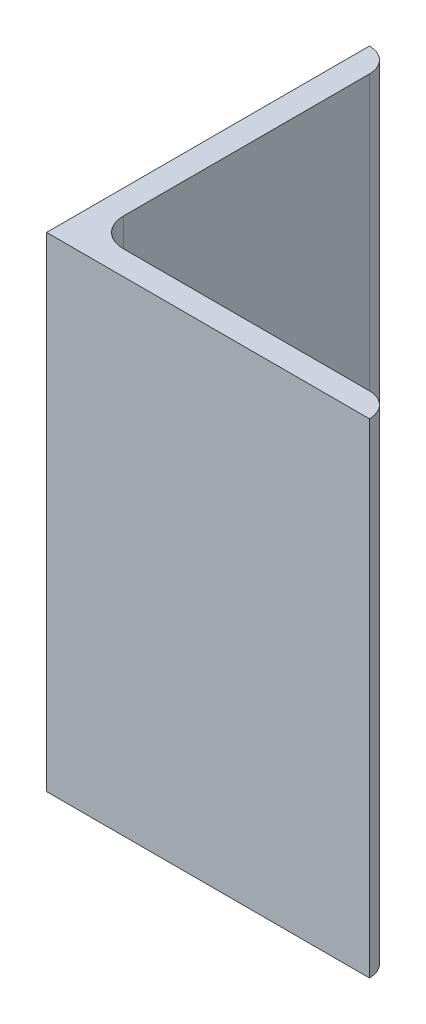
ISO-10303-21;
HEADER;
FILE_DESCRIPTION(('STEP AP214'),'2;1');
FILE_NAME('part.step','',(''),(''),'','','');
FILE_SCHEMA(('AUTOMOTIVE_DESIGN { 1 0 10303 214 1 1 1 1 }'));
ENDSEC;
DATA;
#1=APPLICATION_CONTEXT('core data for automotive mechanical design processes');
#2=APPLICATION_PROTOCOL_DEFINITION('international standard','automotive_design',2000,#1);
#3=PRODUCT_CONTEXT('',#1,'mechanical');
#4=PRODUCT('Part','Part','',(#3));
#5=PRODUCT_RELATED_PRODUCT_CATEGORY('part','',(#4));
#6=PRODUCT_DEFINITION_FORMATION('','',#4);
#7=PRODUCT_DEFINITION_CONTEXT('part definition',#1,'design');
#8=PRODUCT_DEFINITION('design','',#6,#7);
#9=PRODUCT_DEFINITION_SHAPE('','',#8);
#10=(LENGTH_UNIT() NAMED_UNIT(*) SI_UNIT(.MILLI.,.METRE.));
#11=(NAMED_UNIT(*) PLANE_ANGLE_UNIT() SI_UNIT($,.RADIAN.));
#12=(NAMED_UNIT(*) SI_UNIT($,.STERADIAN.) SOLID_ANGLE_UNIT());
#13=UNCERTAINTY_MEASURE_WITH_UNIT(LENGTH_MEASURE(1.E-05),#10,'distance_accuracy_value','');
#14=(GEOMETRIC_REPRESENTATION_CONTEXT(3) GLOBAL_UNCERTAINTY_ASSIGNED_CONTEXT((#13)) GLOBAL_UNIT_ASSIGNED_CONTEXT((#10,
#11,#12)) REPRESENTATION_CONTEXT('',''));
#15=CARTESIAN_POINT('',(0.,0.,0.));
#16=DIRECTION('',(0.,0.,1.));
#17=DIRECTION('',(1.,0.,0.));
#18=AXIS2_PLACEMENT_3D('',#15,#16,#17);
#19=CARTESIAN_POINT('',(40.,60.,0.));
#20=DIRECTION('',(0.,0.,-1.));
#21=DIRECTION('',(-1.,0.,0.));
#22=AXIS2_PLACEMENT_3D('',#19,#20,#21);
#23=PLANE('',#22);
#24=DIRECTION('',(1.,0.,0.));
#25=VECTOR('',#24,1.);
#26=CARTESIAN_POINT('',(40.,0.,0.));
#27=LINE('',#26,#25);
#28=CARTESIAN_POINT('',(0.,0.,0.));
#29=VERTEX_POINT('',#28);
#30=CARTESIAN_POINT('',(40.,0.,0.));
#31=VERTEX_POINT('',#30);
#32=EDGE_CURVE('E160',#29,#31,#27,.T.);
#33=ORIENTED_EDGE('',*,*,#32,.T.);
#34=DIRECTION('',(0.,-1.,0.));
#35=VECTOR('',#34,1.);
#36=CARTESIAN_POINT('',(40.,60.,0.));
#37=LINE('',#36,#35);
#38=CARTESIAN_POINT('',(40.,60.,0.));
#39=VERTEX_POINT('',#38);
#40=EDGE_CURVE('E13',#39,#31,#37,.T.);
#41=ORIENTED_EDGE('',*,*,#40,.F.);
#42=DIRECTION('',(1.,0.,0.));
#43=VECTOR('',#42,1.);
#44=CARTESIAN_POINT('',(40.,60.,0.));
#45=LINE('',#44,#43);
#46=CARTESIAN_POINT('',(0.,60.,0.));
#47=VERTEX_POINT('',#46);
#48=EDGE_CURVE('E179',#47,#39,#45,.T.);
#49=ORIENTED_EDGE('',*,*,#48,.F.);
#50=DIRECTION('',(0.,-1.,0.));
#51=VECTOR('',#50,1.);
#52=CARTESIAN_POINT('',(0.,60.,0.));
#53=LINE('',#52,#51);
#54=EDGE_CURVE('E156',#47,#29,#53,.T.);
#55=ORIENTED_EDGE('',*,*,#54,.T.);
#56=EDGE_LOOP('',(#33,#41,#49,#55));
#57=FACE_BOUND('',#56,.T.);
#58=ADVANCED_FACE('F65',(#57),#23,.F.);
#59=CARTESIAN_POINT('',(37.,60.,0.));
#60=DIRECTION('',(0.,-1.,0.));
#61=DIRECTION('',(0.,0.,-1.));
#62=AXIS2_PLACEMENT_3D('',#59,#60,#61);
#63=CYLINDRICAL_SURFACE('',#62,3.00000000000001);
#64=CARTESIAN_POINT('',(37.,0.,0.));
#65=DIRECTION('',(0.,1.,0.));
#66=DIRECTION('',(0.,0.,1.));
#67=AXIS2_PLACEMENT_3D('',#64,#65,#66);
#68=CIRCLE('',#67,3.00000000000001);
#69=CARTESIAN_POINT('',(37.,0.,-3.));
#70=VERTEX_POINT('',#69);
#71=EDGE_CURVE('E164',#31,#70,#68,.T.);
#72=ORIENTED_EDGE('',*,*,#71,.T.);
#73=DIRECTION('',(0.,-1.,0.));
#74=VECTOR('',#73,1.);
#75=CARTESIAN_POINT('',(37.,60.,-3.));
#76=LINE('',#75,#74);
#77=CARTESIAN_POINT('',(37.,60.,-3.));
#78=VERTEX_POINT('',#77);
#79=EDGE_CURVE('E74',#78,#70,#76,.T.);
#80=ORIENTED_EDGE('',*,*,#79,.F.);
#81=CARTESIAN_POINT('',(37.,60.,0.));
#82=DIRECTION('',(0.,1.,0.));
#83=DIRECTION('',(0.,0.,1.));
#84=AXIS2_PLACEMENT_3D('',#81,#82,#83);
#85=CIRCLE('',#84,3.00000000000001);
#86=EDGE_CURVE('E122',#39,#78,#85,.T.);
#87=ORIENTED_EDGE('',*,*,#86,.F.);
#88=ORIENTED_EDGE('',*,*,#40,.T.);
#89=EDGE_LOOP('',(#72,#80,#87,#88));
#90=FACE_BOUND('',#89,.T.);
#91=ADVANCED_FACE('F213',(#90),#63,.T.);
#92=CARTESIAN_POINT('',(6.5,60.,-3.));
#93=DIRECTION('',(0.,0.,1.));
#94=DIRECTION('',(1.,0.,0.));
#95=AXIS2_PLACEMENT_3D('',#92,#93,#94);
#96=PLANE('',#95);
#97=DIRECTION('',(-1.,0.,0.));
#98=VECTOR('',#97,1.);
#99=CARTESIAN_POINT('',(6.5,0.,-3.));
#100=LINE('',#99,#98);
#101=CARTESIAN_POINT('',(6.5,0.,-3.));
#102=VERTEX_POINT('',#101);
#103=EDGE_CURVE('E167',#70,#102,#100,.T.);
#104=ORIENTED_EDGE('',*,*,#103,.T.);
#105=DIRECTION('',(0.,-1.,0.));
#106=VECTOR('',#105,1.);
#107=CARTESIAN_POINT('',(6.5,60.,-3.));
#108=LINE('',#107,#106);
#109=CARTESIAN_POINT('',(6.5,60.,-3.));
#110=VERTEX_POINT('',#109);
#111=EDGE_CURVE('E186',#110,#102,#108,.T.);
#112=ORIENTED_EDGE('',*,*,#111,.F.);
#113=DIRECTION('',(-1.,0.,0.));
#114=VECTOR('',#113,1.);
#115=CARTESIAN_POINT('',(6.5,60.,-3.));
#116=LINE('',#115,#114);
#117=EDGE_CURVE('E196',#78,#110,#116,.T.);
#118=ORIENTED_EDGE('',*,*,#117,.F.);
#119=ORIENTED_EDGE('',*,*,#79,.T.);
#120=EDGE_LOOP('',(#104,#112,#118,#119));
#121=FACE_BOUND('',#120,.T.);
#122=ADVANCED_FACE('F194',(#121),#96,.F.);
#123=CARTESIAN_POINT('',(6.5,60.,-6.5));
#124=DIRECTION('',(0.,-1.,0.));
#125=DIRECTION('',(0.,0.,-1.));
#126=AXIS2_PLACEMENT_3D('',#123,#124,#125);
#127=CYLINDRICAL_SURFACE('',#126,3.5);
#128=CARTESIAN_POINT('',(6.5,0.,-6.5));
#129=DIRECTION('',(0.,-1.,0.));
#130=DIRECTION('',(0.,0.,-1.));
#131=AXIS2_PLACEMENT_3D('',#128,#129,#130);
#132=CIRCLE('',#131,3.5);
#133=CARTESIAN_POINT('',(3.,0.,-6.5));
#134=VERTEX_POINT('',#133);
#135=EDGE_CURVE('E170',#102,#134,#132,.T.);
#136=ORIENTED_EDGE('',*,*,#135,.T.);
#137=DIRECTION('',(0.,-1.,0.));
#138=VECTOR('',#137,1.);
#139=CARTESIAN_POINT('',(3.,60.,-6.5));
#140=LINE('',#139,#138);
#141=CARTESIAN_POINT('',(3.,60.,-6.5));
#142=VERTEX_POINT('',#141);
#143=EDGE_CURVE('E149',#142,#134,#140,.T.);
#144=ORIENTED_EDGE('',*,*,#143,.F.);
#145=CARTESIAN_POINT('',(6.5,60.,-6.5));
#146=DIRECTION('',(0.,-1.,0.));
#147=DIRECTION('',(0.,0.,-1.));
#148=AXIS2_PLACEMENT_3D('',#145,#146,#147);
#149=CIRCLE('',#148,3.5);
#150=EDGE_CURVE('E138',#110,#142,#149,.T.);
#151=ORIENTED_EDGE('',*,*,#150,.F.);
#152=ORIENTED_EDGE('',*,*,#111,.T.);
#153=EDGE_LOOP('',(#136,#144,#151,#152));
#154=FACE_BOUND('',#153,.T.);
#155=ADVANCED_FACE('F202',(#154),#127,.F.);
#156=CARTESIAN_POINT('',(3.,60.,-37.));
#157=DIRECTION('',(-1.,0.,0.));
#158=DIRECTION('',(0.,0.,1.));
#159=AXIS2_PLACEMENT_3D('',#156,#157,#158);
#160=PLANE('',#159);
#161=DIRECTION('',(0.,0.,-1.));
#162=VECTOR('',#161,1.);
#163=CARTESIAN_POINT('',(3.,0.,-37.));
#164=LINE('',#163,#162);
#165=CARTESIAN_POINT('',(3.,0.,-37.));
#166=VERTEX_POINT('',#165);
#167=EDGE_CURVE('E147',#134,#166,#164,.T.);
#168=ORIENTED_EDGE('',*,*,#167,.T.);
#169=DIRECTION('',(0.,-1.,0.));
#170=VECTOR('',#169,1.);
#171=CARTESIAN_POINT('',(3.,60.,-37.));
#172=LINE('',#171,#170);
#173=CARTESIAN_POINT('',(3.,60.,-37.));
#174=VERTEX_POINT('',#173);
#175=EDGE_CURVE('E144',#174,#166,#172,.T.);
#176=ORIENTED_EDGE('',*,*,#175,.F.);
#177=DIRECTION('',(0.,0.,-1.));
#178=VECTOR('',#177,1.);
#179=CARTESIAN_POINT('',(3.,60.,-37.));
#180=LINE('',#179,#178);
#181=EDGE_CURVE('E132',#142,#174,#180,.T.);
#182=ORIENTED_EDGE('',*,*,#181,.F.);
#183=ORIENTED_EDGE('',*,*,#143,.T.);
#184=EDGE_LOOP('',(#168,#176,#182,#183));
#185=FACE_BOUND('',#184,.T.);
#186=ADVANCED_FACE('F145',(#185),#160,.F.);
#187=CARTESIAN_POINT('',(0.,60.,-37.));
#188=DIRECTION('',(0.,-1.,0.));
#189=DIRECTION('',(0.,0.,-1.));
#190=AXIS2_PLACEMENT_3D('',#187,#188,#189);
#191=CYLINDRICAL_SURFACE('',#190,3.);
#192=CARTESIAN_POINT('',(0.,0.,-37.));
#193=DIRECTION('',(0.,1.,0.));
#194=DIRECTION('',(0.,0.,-1.));
#195=AXIS2_PLACEMENT_3D('',#192,#193,#194);
#196=CIRCLE('',#195,3.);
#197=CARTESIAN_POINT('',(0.,0.,-40.));
#198=VERTEX_POINT('',#197);
#199=EDGE_CURVE('E108',#166,#198,#196,.T.);
#200=ORIENTED_EDGE('',*,*,#199,.T.);
#201=DIRECTION('',(0.,-1.,0.));
#202=VECTOR('',#201,1.);
#203=CARTESIAN_POINT('',(0.,60.,-40.));
#204=LINE('',#203,#202);
#205=CARTESIAN_POINT('',(0.,60.,-40.));
#206=VERTEX_POINT('',#205);
#207=EDGE_CURVE('E150',#206,#198,#204,.T.);
#208=ORIENTED_EDGE('',*,*,#207,.F.);
#209=CARTESIAN_POINT('',(0.,60.,-37.));
#210=DIRECTION('',(0.,1.,0.));
#211=DIRECTION('',(0.,0.,-1.));
#212=AXIS2_PLACEMENT_3D('',#209,#210,#211);
#213=CIRCLE('',#212,3.);
#214=EDGE_CURVE('E136',#174,#206,#213,.T.);
#215=ORIENTED_EDGE('',*,*,#214,.F.);
#216=ORIENTED_EDGE('',*,*,#175,.T.);
#217=EDGE_LOOP('',(#200,#208,#215,#216));
#218=FACE_BOUND('',#217,.T.);
#219=ADVANCED_FACE('F152',(#218),#191,.T.);
#220=CARTESIAN_POINT('',(0.,60.,0.));
#221=DIRECTION('',(1.,0.,0.));
#222=DIRECTION('',(0.,0.,-1.));
#223=AXIS2_PLACEMENT_3D('',#220,#221,#222);
#224=PLANE('',#223);
#225=DIRECTION('',(0.,0.,1.));
#226=VECTOR('',#225,1.);
#227=CARTESIAN_POINT('',(0.,0.,0.));
#228=LINE('',#227,#226);
#229=EDGE_CURVE('E114',#198,#29,#228,.T.);
#230=ORIENTED_EDGE('',*,*,#229,.T.);
#231=ORIENTED_EDGE('',*,*,#54,.F.);
#232=DIRECTION('',(0.,0.,1.));
#233=VECTOR('',#232,1.);
#234=CARTESIAN_POINT('',(0.,60.,0.));
#235=LINE('',#234,#233);
#236=EDGE_CURVE('E82',#206,#47,#235,.T.);
#237=ORIENTED_EDGE('',*,*,#236,.F.);
#238=ORIENTED_EDGE('',*,*,#207,.T.);
#239=EDGE_LOOP('',(#230,#231,#237,#238));
#240=FACE_BOUND('',#239,.T.);
#241=ADVANCED_FACE('F227',(#240),#224,.F.);
#242=CARTESIAN_POINT('',(0.,60.,-37.));
#243=DIRECTION('',(0.,-1.,0.));
#244=DIRECTION('',(0.,0.,-1.));
#245=AXIS2_PLACEMENT_3D('',#242,#243,#244);
#246=PLANE('',#245);
#247=ORIENTED_EDGE('',*,*,#48,.T.);
#248=ORIENTED_EDGE('',*,*,#86,.T.);
#249=ORIENTED_EDGE('',*,*,#117,.T.);
#250=ORIENTED_EDGE('',*,*,#150,.T.);
#251=ORIENTED_EDGE('',*,*,#181,.T.);
#252=ORIENTED_EDGE('',*,*,#214,.T.);
#253=ORIENTED_EDGE('',*,*,#236,.T.);
#254=EDGE_LOOP('',(#247,#248,#249,#250,#251,#252,#253));
#255=FACE_BOUND('',#254,.T.);
#256=ADVANCED_FACE('F134',(#255),#246,.F.);
#257=CARTESIAN_POINT('',(0.,0.,-37.));
#258=DIRECTION('',(0.,-1.,0.));
#259=DIRECTION('',(0.,0.,-1.));
#260=AXIS2_PLACEMENT_3D('',#257,#258,#259);
#261=PLANE('',#260);
#262=ORIENTED_EDGE('',*,*,#32,.F.);
#263=ORIENTED_EDGE('',*,*,#229,.F.);
#264=ORIENTED_EDGE('',*,*,#199,.F.);
#265=ORIENTED_EDGE('',*,*,#167,.F.);
#266=ORIENTED_EDGE('',*,*,#135,.F.);
#267=ORIENTED_EDGE('',*,*,#103,.F.);
#268=ORIENTED_EDGE('',*,*,#71,.F.);
#269=EDGE_LOOP('',(#262,#263,#264,#265,#266,#267,#268));
#270=FACE_BOUND('',#269,.T.);
#271=ADVANCED_FACE('F200',(#270),#261,.T.);
#272=CLOSED_SHELL('',(#58,#91,#122,#155,#186,#219,#241,#256,#271));
#273=MANIFOLD_SOLID_BREP('B2',#272);
#274=ADVANCED_BREP_SHAPE_REPRESENTATION('',(#18,#273),#14);
#275=SHAPE_DEFINITION_REPRESENTATION(#9,#274);
ENDSEC;
END-ISO-10303-21;
